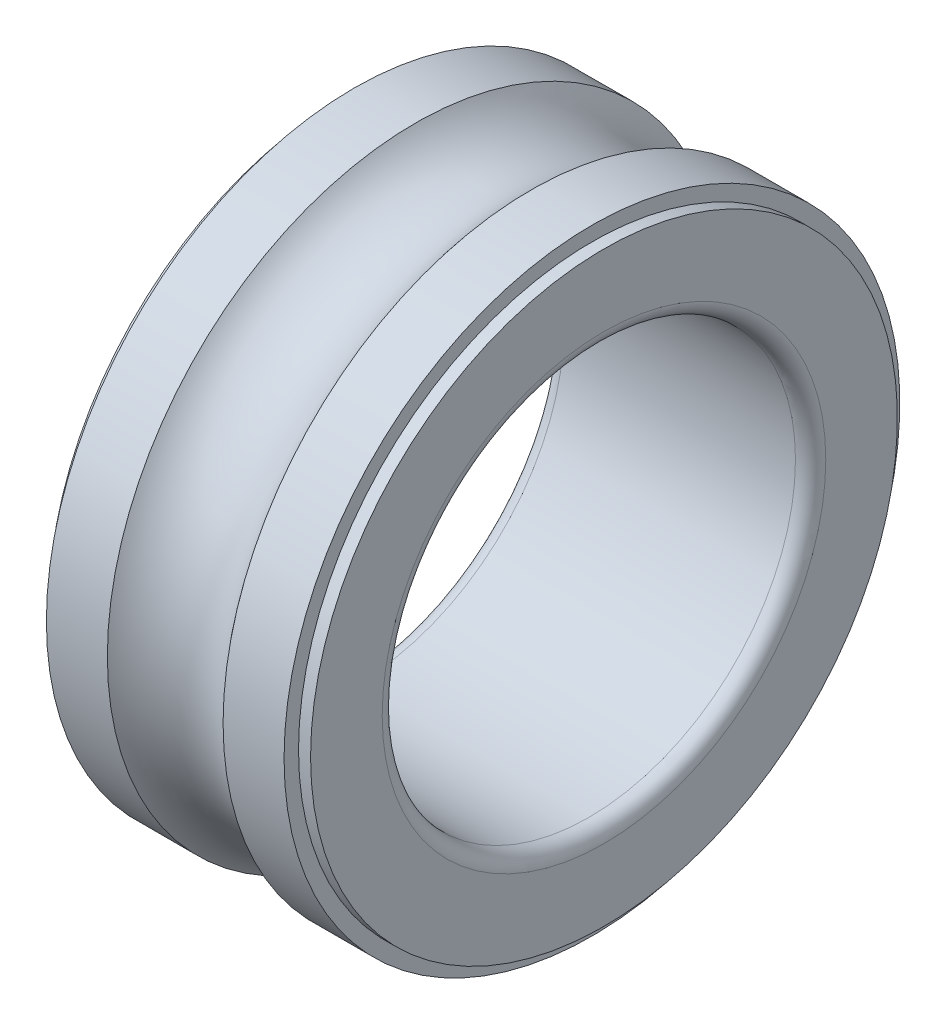
ISO-10303-21;
HEADER;
FILE_DESCRIPTION(('STEP AP214'),'2;1');
FILE_NAME('part.step','',(''),(''),'','','');
FILE_SCHEMA(('AUTOMOTIVE_DESIGN { 1 0 10303 214 1 1 1 1 }'));
ENDSEC;
DATA;
#1=APPLICATION_CONTEXT('core data for automotive mechanical design processes');
#2=APPLICATION_PROTOCOL_DEFINITION('international standard','automotive_design',2000,#1);
#3=PRODUCT_CONTEXT('',#1,'mechanical');
#4=PRODUCT('Part','Part','',(#3));
#5=PRODUCT_RELATED_PRODUCT_CATEGORY('part','',(#4));
#6=PRODUCT_DEFINITION_FORMATION('','',#4);
#7=PRODUCT_DEFINITION_CONTEXT('part definition',#1,'design');
#8=PRODUCT_DEFINITION('design','',#6,#7);
#9=PRODUCT_DEFINITION_SHAPE('','',#8);
#10=(LENGTH_UNIT() NAMED_UNIT(*) SI_UNIT(.MILLI.,.METRE.));
#11=(NAMED_UNIT(*) PLANE_ANGLE_UNIT() SI_UNIT($,.RADIAN.));
#12=(NAMED_UNIT(*) SI_UNIT($,.STERADIAN.) SOLID_ANGLE_UNIT());
#13=UNCERTAINTY_MEASURE_WITH_UNIT(LENGTH_MEASURE(1.E-05),#10,'distance_accuracy_value','');
#14=(GEOMETRIC_REPRESENTATION_CONTEXT(3) GLOBAL_UNCERTAINTY_ASSIGNED_CONTEXT((#13)) GLOBAL_UNIT_ASSIGNED_CONTEXT((#10,
#11,#12)) REPRESENTATION_CONTEXT('',''));
#15=CARTESIAN_POINT('',(0.,0.,0.));
#16=DIRECTION('',(0.,0.,1.));
#17=DIRECTION('',(1.,0.,0.));
#18=AXIS2_PLACEMENT_3D('',#15,#16,#17);
#19=CARTESIAN_POINT('',(0.,-21.6956761217213,-21.3));
#20=DIRECTION('',(-1.,0.,0.));
#21=DIRECTION('',(0.,0.,1.));
#22=AXIS2_PLACEMENT_3D('',#19,#20,#21);
#23=PLANE('',#22);
#24=CARTESIAN_POINT('',(0.,0.,0.));
#25=DIRECTION('',(-1.,0.,0.));
#26=DIRECTION('',(0.,0.,-1.));
#27=AXIS2_PLACEMENT_3D('',#24,#25,#26);
#28=CIRCLE('',#27,21.3);
#29=CARTESIAN_POINT('',(0.,0.,-21.3));
#30=VERTEX_POINT('',#29);
#31=EDGE_CURVE('E55',#30,#30,#28,.F.);
#32=ORIENTED_EDGE('',*,*,#31,.F.);
#33=EDGE_LOOP('',(#32));
#34=FACE_BOUND('',#33,.T.);
#35=CARTESIAN_POINT('',(0.,0.,0.));
#36=DIRECTION('',(1.,0.,0.));
#37=DIRECTION('',(0.,0.,1.));
#38=AXIS2_PLACEMENT_3D('',#35,#36,#37);
#39=CIRCLE('',#38,16.1000000000003);
#40=CARTESIAN_POINT('',(0.,0.,16.1000000000003));
#41=VERTEX_POINT('',#40);
#42=EDGE_CURVE('E52',#41,#41,#39,.T.);
#43=ORIENTED_EDGE('',*,*,#42,.T.);
#44=EDGE_LOOP('',(#43));
#45=FACE_BOUND('',#44,.T.);
#46=ADVANCED_FACE('F14',(#34,#45),#23,.T.);
#47=CARTESIAN_POINT('',(19.,-21.6956761217213,21.3));
#48=DIRECTION('',(1.,0.,0.));
#49=DIRECTION('',(0.,0.,-1.));
#50=AXIS2_PLACEMENT_3D('',#47,#48,#49);
#51=PLANE('',#50);
#52=CARTESIAN_POINT('',(19.,0.,0.));
#53=DIRECTION('',(1.,0.,0.));
#54=DIRECTION('',(0.,0.,1.));
#55=AXIS2_PLACEMENT_3D('',#52,#53,#54);
#56=CIRCLE('',#55,21.3);
#57=CARTESIAN_POINT('',(19.,0.,21.3));
#58=VERTEX_POINT('',#57);
#59=EDGE_CURVE('E49',#58,#58,#56,.T.);
#60=ORIENTED_EDGE('',*,*,#59,.T.);
#61=EDGE_LOOP('',(#60));
#62=FACE_BOUND('',#61,.T.);
#63=CARTESIAN_POINT('',(19.,0.,0.));
#64=DIRECTION('',(-1.,0.,0.));
#65=DIRECTION('',(0.,0.,-1.));
#66=AXIS2_PLACEMENT_3D('',#63,#64,#65);
#67=CIRCLE('',#66,16.1);
#68=CARTESIAN_POINT('',(19.,0.,-16.1));
#69=VERTEX_POINT('',#68);
#70=EDGE_CURVE('E46',#69,#69,#67,.F.);
#71=ORIENTED_EDGE('',*,*,#70,.F.);
#72=EDGE_LOOP('',(#71));
#73=FACE_BOUND('',#72,.T.);
#74=ADVANCED_FACE('F63',(#62,#73),#51,.T.);
#75=CARTESIAN_POINT('',(18.126,-22.7651812826513,22.35));
#76=DIRECTION('',(1.,0.,0.));
#77=DIRECTION('',(0.,0.,-1.));
#78=AXIS2_PLACEMENT_3D('',#75,#76,#77);
#79=PLANE('',#78);
#80=CARTESIAN_POINT('',(18.126,0.,0.));
#81=DIRECTION('',(1.,0.,0.));
#82=DIRECTION('',(0.,0.,1.));
#83=AXIS2_PLACEMENT_3D('',#80,#81,#82);
#84=CIRCLE('',#83,22.35);
#85=CARTESIAN_POINT('',(18.126,0.,22.35));
#86=VERTEX_POINT('',#85);
#87=EDGE_CURVE('E43',#86,#86,#84,.T.);
#88=ORIENTED_EDGE('',*,*,#87,.T.);
#89=EDGE_LOOP('',(#88));
#90=FACE_BOUND('',#89,.T.);
#91=CARTESIAN_POINT('',(18.126,0.,0.));
#92=DIRECTION('',(-1.,0.,0.));
#93=DIRECTION('',(0.,0.,-1.));
#94=AXIS2_PLACEMENT_3D('',#91,#92,#93);
#95=CIRCLE('',#94,21.3);
#96=CARTESIAN_POINT('',(18.126,0.,-21.3));
#97=VERTEX_POINT('',#96);
#98=EDGE_CURVE('E40',#97,#97,#95,.F.);
#99=ORIENTED_EDGE('',*,*,#98,.F.);
#100=EDGE_LOOP('',(#99));
#101=FACE_BOUND('',#100,.T.);
#102=ADVANCED_FACE('F81',(#90,#101),#79,.T.);
#103=CARTESIAN_POINT('',(0.874,-22.7651812826513,-22.35));
#104=DIRECTION('',(-1.,0.,0.));
#105=DIRECTION('',(0.,0.,1.));
#106=AXIS2_PLACEMENT_3D('',#103,#104,#105);
#107=PLANE('',#106);
#108=CARTESIAN_POINT('',(0.874,0.,0.));
#109=DIRECTION('',(-1.,0.,0.));
#110=DIRECTION('',(0.,0.,-1.));
#111=AXIS2_PLACEMENT_3D('',#108,#109,#110);
#112=CIRCLE('',#111,22.35);
#113=CARTESIAN_POINT('',(0.874,0.,-22.35));
#114=VERTEX_POINT('',#113);
#115=EDGE_CURVE('E37',#114,#114,#112,.F.);
#116=ORIENTED_EDGE('',*,*,#115,.F.);
#117=EDGE_LOOP('',(#116));
#118=FACE_BOUND('',#117,.T.);
#119=CARTESIAN_POINT('',(0.874,0.,0.));
#120=DIRECTION('',(1.,0.,0.));
#121=DIRECTION('',(0.,0.,1.));
#122=AXIS2_PLACEMENT_3D('',#119,#120,#121);
#123=CIRCLE('',#122,21.3);
#124=CARTESIAN_POINT('',(0.874,0.,21.3));
#125=VERTEX_POINT('',#124);
#126=EDGE_CURVE('E34',#125,#125,#123,.T.);
#127=ORIENTED_EDGE('',*,*,#126,.T.);
#128=EDGE_LOOP('',(#127));
#129=FACE_BOUND('',#128,.T.);
#130=ADVANCED_FACE('F70',(#118,#129),#107,.T.);
#131=CARTESIAN_POINT('',(1.10000000000035,0.,0.));
#132=DIRECTION('',(1.,0.,0.));
#133=DIRECTION('',(0.,0.,1.));
#134=AXIS2_PLACEMENT_3D('',#131,#132,#133);
#135=TOROIDAL_SURFACE('',#134,16.1000000000003,1.10000000000035);
#136=CARTESIAN_POINT('',(1.1,0.,0.));
#137=DIRECTION('',(1.,0.,0.));
#138=DIRECTION('',(0.,0.,1.));
#139=AXIS2_PLACEMENT_3D('',#136,#137,#138);
#140=CIRCLE('',#139,15.);
#141=CARTESIAN_POINT('',(1.1,0.,15.));
#142=VERTEX_POINT('',#141);
#143=EDGE_CURVE('E29',#142,#142,#140,.T.);
#144=ORIENTED_EDGE('',*,*,#143,.T.);
#145=EDGE_LOOP('',(#144));
#146=FACE_BOUND('',#145,.T.);
#147=ORIENTED_EDGE('',*,*,#42,.F.);
#148=EDGE_LOOP('',(#147));
#149=FACE_BOUND('',#148,.T.);
#150=ADVANCED_FACE('F67',(#146,#149),#135,.T.);
#151=CARTESIAN_POINT('',(19.,0.,0.));
#152=DIRECTION('',(1.,0.,0.));
#153=DIRECTION('',(0.,0.,1.));
#154=AXIS2_PLACEMENT_3D('',#151,#152,#153);
#155=CYLINDRICAL_SURFACE('',#154,15.);
#156=CARTESIAN_POINT('',(17.9,0.,0.));
#157=DIRECTION('',(1.,0.,0.));
#158=DIRECTION('',(0.,0.,1.));
#159=AXIS2_PLACEMENT_3D('',#156,#157,#158);
#160=CIRCLE('',#159,15.);
#161=CARTESIAN_POINT('',(17.9,0.,15.));
#162=VERTEX_POINT('',#161);
#163=EDGE_CURVE('E25',#162,#162,#160,.T.);
#164=ORIENTED_EDGE('',*,*,#163,.T.);
#165=EDGE_LOOP('',(#164));
#166=FACE_BOUND('',#165,.T.);
#167=ORIENTED_EDGE('',*,*,#143,.F.);
#168=EDGE_LOOP('',(#167));
#169=FACE_BOUND('',#168,.T.);
#170=ADVANCED_FACE('F69',(#166,#169),#155,.F.);
#171=CARTESIAN_POINT('',(17.8999999999993,0.,0.));
#172=DIRECTION('',(1.,0.,0.));
#173=DIRECTION('',(0.,0.,1.));
#174=AXIS2_PLACEMENT_3D('',#171,#172,#173);
#175=TOROIDAL_SURFACE('',#174,16.1000000000007,1.10000000000069);
#176=ORIENTED_EDGE('',*,*,#70,.T.);
#177=EDGE_LOOP('',(#176));
#178=FACE_BOUND('',#177,.T.);
#179=ORIENTED_EDGE('',*,*,#163,.F.);
#180=EDGE_LOOP('',(#179));
#181=FACE_BOUND('',#180,.T.);
#182=ADVANCED_FACE('F78',(#178,#181),#175,.T.);
#183=CARTESIAN_POINT('',(19.,0.,0.));
#184=DIRECTION('',(1.,0.,0.));
#185=DIRECTION('',(0.,0.,1.));
#186=AXIS2_PLACEMENT_3D('',#183,#184,#185);
#187=CYLINDRICAL_SURFACE('',#186,21.3);
#188=ORIENTED_EDGE('',*,*,#98,.T.);
#189=EDGE_LOOP('',(#188));
#190=FACE_BOUND('',#189,.T.);
#191=ORIENTED_EDGE('',*,*,#59,.F.);
#192=EDGE_LOOP('',(#191));
#193=FACE_BOUND('',#192,.T.);
#194=ADVANCED_FACE('F88',(#190,#193),#187,.T.);
#195=CARTESIAN_POINT('',(19.,0.,0.));
#196=DIRECTION('',(1.,0.,0.));
#197=DIRECTION('',(0.,0.,1.));
#198=AXIS2_PLACEMENT_3D('',#195,#196,#197);
#199=CYLINDRICAL_SURFACE('',#198,22.35);
#200=CARTESIAN_POINT('',(13.7,0.,0.));
#201=DIRECTION('',(1.,0.,0.));
#202=DIRECTION('',(0.,0.,1.));
#203=AXIS2_PLACEMENT_3D('',#200,#201,#202);
#204=CIRCLE('',#203,22.35);
#205=CARTESIAN_POINT('',(13.7,0.,22.35));
#206=VERTEX_POINT('',#205);
#207=EDGE_CURVE('E21',#206,#206,#204,.T.);
#208=ORIENTED_EDGE('',*,*,#207,.T.);
#209=EDGE_LOOP('',(#208));
#210=FACE_BOUND('',#209,.T.);
#211=ORIENTED_EDGE('',*,*,#87,.F.);
#212=EDGE_LOOP('',(#211));
#213=FACE_BOUND('',#212,.T.);
#214=ADVANCED_FACE('F92',(#210,#213),#199,.T.);
#215=CARTESIAN_POINT('',(9.5,0.,0.));
#216=DIRECTION('',(1.,0.,0.));
#217=DIRECTION('',(0.,0.,1.));
#218=AXIS2_PLACEMENT_3D('',#215,#216,#217);
#219=TOROIDAL_SURFACE('',#218,25.5,5.25);
#220=ORIENTED_EDGE('',*,*,#207,.F.);
#221=EDGE_LOOP('',(#220));
#222=FACE_BOUND('',#221,.T.);
#223=CARTESIAN_POINT('',(5.3,0.,0.));
#224=DIRECTION('',(1.,0.,0.));
#225=DIRECTION('',(0.,0.,1.));
#226=AXIS2_PLACEMENT_3D('',#223,#224,#225);
#227=CIRCLE('',#226,22.35);
#228=CARTESIAN_POINT('',(5.3,0.,22.35));
#229=VERTEX_POINT('',#228);
#230=EDGE_CURVE('E10',#229,#229,#227,.T.);
#231=ORIENTED_EDGE('',*,*,#230,.T.);
#232=EDGE_LOOP('',(#231));
#233=FACE_BOUND('',#232,.T.);
#234=ADVANCED_FACE('F96',(#222,#233),#219,.F.);
#235=CARTESIAN_POINT('',(19.,0.,0.));
#236=DIRECTION('',(1.,0.,0.));
#237=DIRECTION('',(0.,0.,1.));
#238=AXIS2_PLACEMENT_3D('',#235,#236,#237);
#239=CYLINDRICAL_SURFACE('',#238,22.35);
#240=ORIENTED_EDGE('',*,*,#115,.T.);
#241=EDGE_LOOP('',(#240));
#242=FACE_BOUND('',#241,.T.);
#243=ORIENTED_EDGE('',*,*,#230,.F.);
#244=EDGE_LOOP('',(#243));
#245=FACE_BOUND('',#244,.T.);
#246=ADVANCED_FACE('F98',(#242,#245),#239,.T.);
#247=CARTESIAN_POINT('',(19.,0.,0.));
#248=DIRECTION('',(1.,0.,0.));
#249=DIRECTION('',(0.,0.,1.));
#250=AXIS2_PLACEMENT_3D('',#247,#248,#249);
#251=CYLINDRICAL_SURFACE('',#250,21.3);
#252=ORIENTED_EDGE('',*,*,#31,.T.);
#253=EDGE_LOOP('',(#252));
#254=FACE_BOUND('',#253,.T.);
#255=ORIENTED_EDGE('',*,*,#126,.F.);
#256=EDGE_LOOP('',(#255));
#257=FACE_BOUND('',#256,.T.);
#258=ADVANCED_FACE('F16',(#254,#257),#251,.T.);
#259=CLOSED_SHELL('',(#46,#74,#102,#130,#150,#170,#182,#194,#214,#234,#246,#258));
#260=MANIFOLD_SOLID_BREP('B1',#259);
#261=ADVANCED_BREP_SHAPE_REPRESENTATION('',(#18,#260),#14);
#262=SHAPE_DEFINITION_REPRESENTATION(#9,#261);
ENDSEC;
END-ISO-10303-21;
